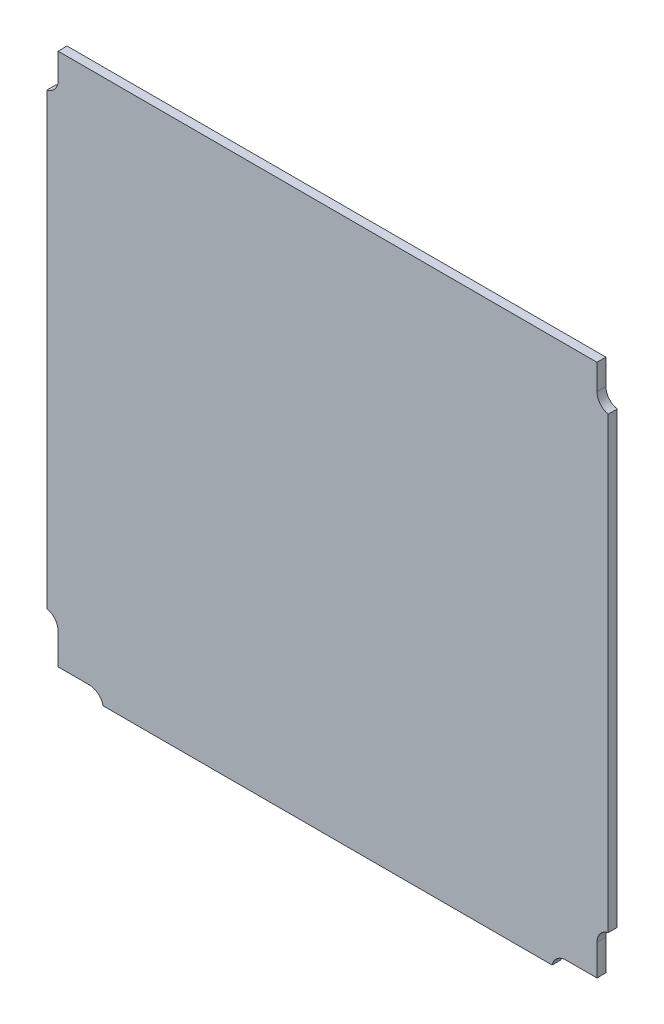
ISO-10303-21;
HEADER;
FILE_DESCRIPTION(('STEP AP214'),'2;1');
FILE_NAME('part.step','',(''),(''),'','','');
FILE_SCHEMA(('AUTOMOTIVE_DESIGN { 1 0 10303 214 1 1 1 1 }'));
ENDSEC;
DATA;
#1=APPLICATION_CONTEXT('core data for automotive mechanical design processes');
#2=APPLICATION_PROTOCOL_DEFINITION('international standard','automotive_design',2000,#1);
#3=PRODUCT_CONTEXT('',#1,'mechanical');
#4=PRODUCT('Part','Part','',(#3));
#5=PRODUCT_RELATED_PRODUCT_CATEGORY('part','',(#4));
#6=PRODUCT_DEFINITION_FORMATION('','',#4);
#7=PRODUCT_DEFINITION_CONTEXT('part definition',#1,'design');
#8=PRODUCT_DEFINITION('design','',#6,#7);
#9=PRODUCT_DEFINITION_SHAPE('','',#8);
#10=(LENGTH_UNIT() NAMED_UNIT(*) SI_UNIT(.MILLI.,.METRE.));
#11=(NAMED_UNIT(*) PLANE_ANGLE_UNIT() SI_UNIT($,.RADIAN.));
#12=(NAMED_UNIT(*) SI_UNIT($,.STERADIAN.) SOLID_ANGLE_UNIT());
#13=UNCERTAINTY_MEASURE_WITH_UNIT(LENGTH_MEASURE(1.E-05),#10,'distance_accuracy_value','');
#14=(GEOMETRIC_REPRESENTATION_CONTEXT(3) GLOBAL_UNCERTAINTY_ASSIGNED_CONTEXT((#13)) GLOBAL_UNIT_ASSIGNED_CONTEXT((#10,
#11,#12)) REPRESENTATION_CONTEXT('',''));
#15=CARTESIAN_POINT('',(0.,0.,0.));
#16=DIRECTION('',(0.,0.,1.));
#17=DIRECTION('',(1.,0.,0.));
#18=AXIS2_PLACEMENT_3D('',#15,#16,#17);
#19=CARTESIAN_POINT('',(48.,0.,1.5875));
#20=DIRECTION('',(-1.,0.,0.));
#21=DIRECTION('',(0.,0.,1.));
#22=AXIS2_PLACEMENT_3D('',#19,#20,#21);
#23=PLANE('',#22);
#24=DIRECTION('',(0.,1.,0.));
#25=VECTOR('',#24,1.);
#26=CARTESIAN_POINT('',(48.,0.,1.5875));
#27=LINE('',#26,#25);
#28=CARTESIAN_POINT('',(48.,42.4819347291982,1.5875));
#29=VERTEX_POINT('',#28);
#30=CARTESIAN_POINT('',(48.,47.,1.5875));
#31=VERTEX_POINT('',#30);
#32=EDGE_CURVE('E149',#29,#31,#27,.T.);
#33=ORIENTED_EDGE('',*,*,#32,.F.);
#34=DIRECTION('',(0.,0.,-1.));
#35=VECTOR('',#34,1.);
#36=CARTESIAN_POINT('',(48.,42.4819347291982,1.5875));
#37=LINE('',#36,#35);
#38=CARTESIAN_POINT('',(48.,42.4819347291982,0.));
#39=VERTEX_POINT('',#38);
#40=EDGE_CURVE('E188',#29,#39,#37,.T.);
#41=ORIENTED_EDGE('',*,*,#40,.T.);
#42=DIRECTION('',(0.,1.,0.));
#43=VECTOR('',#42,1.);
#44=CARTESIAN_POINT('',(48.,0.,0.));
#45=LINE('',#44,#43);
#46=CARTESIAN_POINT('',(48.,47.,0.));
#47=VERTEX_POINT('',#46);
#48=EDGE_CURVE('E171',#39,#47,#45,.T.);
#49=ORIENTED_EDGE('',*,*,#48,.T.);
#50=DIRECTION('',(0.,0.,-1.));
#51=VECTOR('',#50,1.);
#52=CARTESIAN_POINT('',(48.,47.,1.5875));
#53=LINE('',#52,#51);
#54=EDGE_CURVE('E165',#31,#47,#53,.T.);
#55=ORIENTED_EDGE('',*,*,#54,.F.);
#56=EDGE_LOOP('',(#33,#41,#49,#55));
#57=FACE_BOUND('',#56,.T.);
#58=ADVANCED_FACE('F37',(#57),#23,.F.);
#59=CARTESIAN_POINT('',(0.,47.,1.5875));
#60=DIRECTION('',(0.,-1.,0.));
#61=DIRECTION('',(1.,0.,0.));
#62=AXIS2_PLACEMENT_3D('',#59,#60,#61);
#63=PLANE('',#62);
#64=DIRECTION('',(-1.,0.,0.));
#65=VECTOR('',#64,1.);
#66=CARTESIAN_POINT('',(0.,47.,0.));
#67=LINE('',#66,#65);
#68=CARTESIAN_POINT('',(-48.,47.,0.));
#69=VERTEX_POINT('',#68);
#70=EDGE_CURVE('E263',#47,#69,#67,.T.);
#71=ORIENTED_EDGE('',*,*,#70,.T.);
#72=DIRECTION('',(0.,0.,-1.));
#73=VECTOR('',#72,1.);
#74=CARTESIAN_POINT('',(-48.,47.,1.5875));
#75=LINE('',#74,#73);
#76=CARTESIAN_POINT('',(-48.,47.,1.5875));
#77=VERTEX_POINT('',#76);
#78=EDGE_CURVE('E167',#77,#69,#75,.T.);
#79=ORIENTED_EDGE('',*,*,#78,.F.);
#80=DIRECTION('',(-1.,0.,0.));
#81=VECTOR('',#80,1.);
#82=CARTESIAN_POINT('',(0.,47.,1.5875));
#83=LINE('',#82,#81);
#84=EDGE_CURVE('E152',#31,#77,#83,.T.);
#85=ORIENTED_EDGE('',*,*,#84,.F.);
#86=ORIENTED_EDGE('',*,*,#54,.T.);
#87=EDGE_LOOP('',(#71,#79,#85,#86));
#88=FACE_BOUND('',#87,.T.);
#89=ADVANCED_FACE('F164',(#88),#63,.F.);
#90=CARTESIAN_POINT('',(-48.0000000000001,1.42742960308949E-13,1.5875));
#91=DIRECTION('',(1.,0.,0.));
#92=DIRECTION('',(0.,1.,0.));
#93=AXIS2_PLACEMENT_3D('',#90,#91,#92);
#94=PLANE('',#93);
#95=DIRECTION('',(0.,-1.,0.));
#96=VECTOR('',#95,1.);
#97=CARTESIAN_POINT('',(-48.0000000000001,1.42742960308949E-13,0.));
#98=LINE('',#97,#96);
#99=CARTESIAN_POINT('',(-48.,42.4819347291981,0.));
#100=VERTEX_POINT('',#99);
#101=EDGE_CURVE('E259',#69,#100,#98,.T.);
#102=ORIENTED_EDGE('',*,*,#101,.T.);
#103=DIRECTION('',(0.,0.,-1.));
#104=VECTOR('',#103,1.);
#105=CARTESIAN_POINT('',(-48.,42.4819347291981,1.5875));
#106=LINE('',#105,#104);
#107=CARTESIAN_POINT('',(-48.,42.4819347291981,1.5875));
#108=VERTEX_POINT('',#107);
#109=EDGE_CURVE('E52',#100,#108,#106,.F.);
#110=ORIENTED_EDGE('',*,*,#109,.T.);
#111=DIRECTION('',(0.,-1.,0.));
#112=VECTOR('',#111,1.);
#113=CARTESIAN_POINT('',(-48.0000000000001,1.42742960308949E-13,1.5875));
#114=LINE('',#113,#112);
#115=EDGE_CURVE('E168',#77,#108,#114,.T.);
#116=ORIENTED_EDGE('',*,*,#115,.F.);
#117=ORIENTED_EDGE('',*,*,#78,.T.);
#118=EDGE_LOOP('',(#102,#110,#116,#117));
#119=FACE_BOUND('',#118,.T.);
#120=ADVANCED_FACE('F292',(#119),#94,.F.);
#121=CARTESIAN_POINT('',(-50.,0.,1.5875));
#122=DIRECTION('',(-1.,0.,0.));
#123=DIRECTION('',(0.,-1.,0.));
#124=AXIS2_PLACEMENT_3D('',#121,#122,#123);
#125=PLANE('',#124);
#126=DIRECTION('',(0.,1.,0.));
#127=VECTOR('',#126,1.);
#128=CARTESIAN_POINT('',(-50.,0.,0.));
#129=LINE('',#128,#127);
#130=CARTESIAN_POINT('',(-50.,-40.,0.));
#131=VERTEX_POINT('',#130);
#132=CARTESIAN_POINT('',(-50.,40.,0.));
#133=VERTEX_POINT('',#132);
#134=EDGE_CURVE('E252',#131,#133,#129,.T.);
#135=ORIENTED_EDGE('',*,*,#134,.F.);
#136=DIRECTION('',(0.,0.,-1.));
#137=VECTOR('',#136,1.);
#138=CARTESIAN_POINT('',(-50.,-40.,1.5875));
#139=LINE('',#138,#137);
#140=CARTESIAN_POINT('',(-50.,-40.,1.5875));
#141=VERTEX_POINT('',#140);
#142=EDGE_CURVE('E244',#141,#131,#139,.T.);
#143=ORIENTED_EDGE('',*,*,#142,.F.);
#144=DIRECTION('',(0.,1.,0.));
#145=VECTOR('',#144,1.);
#146=CARTESIAN_POINT('',(-50.,0.,1.5875));
#147=LINE('',#146,#145);
#148=CARTESIAN_POINT('',(-50.,40.,1.5875));
#149=VERTEX_POINT('',#148);
#150=EDGE_CURVE('E254',#141,#149,#147,.T.);
#151=ORIENTED_EDGE('',*,*,#150,.T.);
#152=DIRECTION('',(0.,0.,-1.));
#153=VECTOR('',#152,1.);
#154=CARTESIAN_POINT('',(-50.,40.,1.5875));
#155=LINE('',#154,#153);
#156=EDGE_CURVE('E178',#149,#133,#155,.T.);
#157=ORIENTED_EDGE('',*,*,#156,.T.);
#158=EDGE_LOOP('',(#135,#143,#151,#157));
#159=FACE_BOUND('',#158,.T.);
#160=ADVANCED_FACE('F251',(#159),#125,.T.);
#161=CARTESIAN_POINT('',(-47.9999999999999,0.,1.5875));
#162=DIRECTION('',(1.,0.,0.));
#163=DIRECTION('',(0.,1.,0.));
#164=AXIS2_PLACEMENT_3D('',#161,#162,#163);
#165=PLANE('',#164);
#166=DIRECTION('',(0.,-1.,0.));
#167=VECTOR('',#166,1.);
#168=CARTESIAN_POINT('',(-47.9999999999999,0.,1.5875));
#169=LINE('',#168,#167);
#170=CARTESIAN_POINT('',(-48.,-42.4819347291982,1.5875));
#171=VERTEX_POINT('',#170);
#172=CARTESIAN_POINT('',(-48.,-48.,1.5875));
#173=VERTEX_POINT('',#172);
#174=EDGE_CURVE('E294',#171,#173,#169,.T.);
#175=ORIENTED_EDGE('',*,*,#174,.F.);
#176=DIRECTION('',(0.,0.,1.));
#177=VECTOR('',#176,1.);
#178=CARTESIAN_POINT('',(-48.,-42.4819347291982,1.5875));
#179=LINE('',#178,#177);
#180=CARTESIAN_POINT('',(-48.,-42.4819347291982,0.));
#181=VERTEX_POINT('',#180);
#182=EDGE_CURVE('E173',#171,#181,#179,.F.);
#183=ORIENTED_EDGE('',*,*,#182,.T.);
#184=DIRECTION('',(0.,-1.,0.));
#185=VECTOR('',#184,1.);
#186=CARTESIAN_POINT('',(-47.9999999999999,0.,0.));
#187=LINE('',#186,#185);
#188=CARTESIAN_POINT('',(-48.,-48.,0.));
#189=VERTEX_POINT('',#188);
#190=EDGE_CURVE('E258',#181,#189,#187,.T.);
#191=ORIENTED_EDGE('',*,*,#190,.T.);
#192=DIRECTION('',(0.,0.,-1.));
#193=VECTOR('',#192,1.);
#194=CARTESIAN_POINT('',(-48.,-48.,1.5875));
#195=LINE('',#194,#193);
#196=EDGE_CURVE('E241',#173,#189,#195,.T.);
#197=ORIENTED_EDGE('',*,*,#196,.F.);
#198=EDGE_LOOP('',(#175,#183,#191,#197));
#199=FACE_BOUND('',#198,.T.);
#200=ADVANCED_FACE('F342',(#199),#165,.F.);
#201=CARTESIAN_POINT('',(0.,-48.0000000000001,1.5875));
#202=DIRECTION('',(0.,1.,0.));
#203=DIRECTION('',(-1.,0.,0.));
#204=AXIS2_PLACEMENT_3D('',#201,#202,#203);
#205=PLANE('',#204);
#206=DIRECTION('',(1.,0.,0.));
#207=VECTOR('',#206,1.);
#208=CARTESIAN_POINT('',(0.,-48.0000000000001,0.));
#209=LINE('',#208,#207);
#210=CARTESIAN_POINT('',(-42.4819347291981,-48.,0.));
#211=VERTEX_POINT('',#210);
#212=EDGE_CURVE('E261',#189,#211,#209,.T.);
#213=ORIENTED_EDGE('',*,*,#212,.T.);
#214=DIRECTION('',(0.,0.,1.));
#215=VECTOR('',#214,1.);
#216=CARTESIAN_POINT('',(-42.4819347291981,-48.,1.5875));
#217=LINE('',#216,#215);
#218=CARTESIAN_POINT('',(-42.4819347291981,-48.,1.5875));
#219=VERTEX_POINT('',#218);
#220=EDGE_CURVE('E176',#211,#219,#217,.T.);
#221=ORIENTED_EDGE('',*,*,#220,.T.);
#222=DIRECTION('',(1.,0.,0.));
#223=VECTOR('',#222,1.);
#224=CARTESIAN_POINT('',(0.,-48.0000000000001,1.5875));
#225=LINE('',#224,#223);
#226=EDGE_CURVE('E298',#173,#219,#225,.T.);
#227=ORIENTED_EDGE('',*,*,#226,.F.);
#228=ORIENTED_EDGE('',*,*,#196,.T.);
#229=EDGE_LOOP('',(#213,#221,#227,#228));
#230=FACE_BOUND('',#229,.T.);
#231=ADVANCED_FACE('F317',(#230),#205,.F.);
#232=CARTESIAN_POINT('',(0.,-50.,1.5875));
#233=DIRECTION('',(0.,1.,0.));
#234=DIRECTION('',(0.,0.,1.));
#235=AXIS2_PLACEMENT_3D('',#232,#233,#234);
#236=PLANE('',#235);
#237=DIRECTION('',(1.,0.,0.));
#238=VECTOR('',#237,1.);
#239=CARTESIAN_POINT('',(0.,-50.,0.));
#240=LINE('',#239,#238);
#241=CARTESIAN_POINT('',(-40.,-50.,0.));
#242=VERTEX_POINT('',#241);
#243=CARTESIAN_POINT('',(40.,-50.,0.));
#244=VERTEX_POINT('',#243);
#245=EDGE_CURVE('E269',#242,#244,#240,.T.);
#246=ORIENTED_EDGE('',*,*,#245,.T.);
#247=DIRECTION('',(0.,0.,-1.));
#248=VECTOR('',#247,1.);
#249=CARTESIAN_POINT('',(40.,-50.,1.5875));
#250=LINE('',#249,#248);
#251=CARTESIAN_POINT('',(40.,-50.,1.5875));
#252=VERTEX_POINT('',#251);
#253=EDGE_CURVE('E235',#252,#244,#250,.T.);
#254=ORIENTED_EDGE('',*,*,#253,.F.);
#255=DIRECTION('',(1.,0.,0.));
#256=VECTOR('',#255,1.);
#257=CARTESIAN_POINT('',(0.,-50.,1.5875));
#258=LINE('',#257,#256);
#259=CARTESIAN_POINT('',(-40.,-50.,1.5875));
#260=VERTEX_POINT('',#259);
#261=EDGE_CURVE('E288',#260,#252,#258,.T.);
#262=ORIENTED_EDGE('',*,*,#261,.F.);
#263=DIRECTION('',(0.,0.,-1.));
#264=VECTOR('',#263,1.);
#265=CARTESIAN_POINT('',(-40.,-50.,1.5875));
#266=LINE('',#265,#264);
#267=EDGE_CURVE('E238',#260,#242,#266,.T.);
#268=ORIENTED_EDGE('',*,*,#267,.T.);
#269=EDGE_LOOP('',(#246,#254,#262,#268));
#270=FACE_BOUND('',#269,.T.);
#271=ADVANCED_FACE('F306',(#270),#236,.F.);
#272=CARTESIAN_POINT('',(-1.2490009027033E-13,-47.9999999999999,1.5875));
#273=DIRECTION('',(0.,1.,0.));
#274=DIRECTION('',(-1.,0.,0.));
#275=AXIS2_PLACEMENT_3D('',#272,#273,#274);
#276=PLANE('',#275);
#277=DIRECTION('',(1.,0.,0.));
#278=VECTOR('',#277,1.);
#279=CARTESIAN_POINT('',(-1.2490009027033E-13,-47.9999999999999,1.5875));
#280=LINE('',#279,#278);
#281=CARTESIAN_POINT('',(42.4819347291982,-48.,1.5875));
#282=VERTEX_POINT('',#281);
#283=CARTESIAN_POINT('',(48.,-48.,1.5875));
#284=VERTEX_POINT('',#283);
#285=EDGE_CURVE('E286',#282,#284,#280,.T.);
#286=ORIENTED_EDGE('',*,*,#285,.F.);
#287=DIRECTION('',(0.,0.,-1.));
#288=VECTOR('',#287,1.);
#289=CARTESIAN_POINT('',(42.4819347291982,-48.,1.5875));
#290=LINE('',#289,#288);
#291=CARTESIAN_POINT('',(42.4819347291982,-48.,0.));
#292=VERTEX_POINT('',#291);
#293=EDGE_CURVE('E183',#282,#292,#290,.T.);
#294=ORIENTED_EDGE('',*,*,#293,.T.);
#295=DIRECTION('',(1.,0.,0.));
#296=VECTOR('',#295,1.);
#297=CARTESIAN_POINT('',(-1.2490009027033E-13,-47.9999999999999,0.));
#298=LINE('',#297,#296);
#299=CARTESIAN_POINT('',(48.,-48.,0.));
#300=VERTEX_POINT('',#299);
#301=EDGE_CURVE('E272',#292,#300,#298,.T.);
#302=ORIENTED_EDGE('',*,*,#301,.T.);
#303=DIRECTION('',(0.,0.,-1.));
#304=VECTOR('',#303,1.);
#305=CARTESIAN_POINT('',(48.,-48.,1.5875));
#306=LINE('',#305,#304);
#307=EDGE_CURVE('E227',#284,#300,#306,.T.);
#308=ORIENTED_EDGE('',*,*,#307,.F.);
#309=EDGE_LOOP('',(#286,#294,#302,#308));
#310=FACE_BOUND('',#309,.T.);
#311=ADVANCED_FACE('F312',(#310),#276,.F.);
#312=CARTESIAN_POINT('',(48.0000000000001,0.,1.5875));
#313=DIRECTION('',(-1.,0.,0.));
#314=DIRECTION('',(0.,-1.,0.));
#315=AXIS2_PLACEMENT_3D('',#312,#313,#314);
#316=PLANE('',#315);
#317=DIRECTION('',(0.,1.,0.));
#318=VECTOR('',#317,1.);
#319=CARTESIAN_POINT('',(48.0000000000001,0.,0.));
#320=LINE('',#319,#318);
#321=CARTESIAN_POINT('',(48.,-42.4819347291982,0.));
#322=VERTEX_POINT('',#321);
#323=EDGE_CURVE('E222',#300,#322,#320,.T.);
#324=ORIENTED_EDGE('',*,*,#323,.T.);
#325=DIRECTION('',(0.,0.,1.));
#326=VECTOR('',#325,1.);
#327=CARTESIAN_POINT('',(48.,-42.4819347291982,1.5875));
#328=LINE('',#327,#326);
#329=CARTESIAN_POINT('',(48.,-42.4819347291982,1.5875));
#330=VERTEX_POINT('',#329);
#331=EDGE_CURVE('E186',#322,#330,#328,.T.);
#332=ORIENTED_EDGE('',*,*,#331,.T.);
#333=DIRECTION('',(0.,1.,0.));
#334=VECTOR('',#333,1.);
#335=CARTESIAN_POINT('',(48.0000000000001,0.,1.5875));
#336=LINE('',#335,#334);
#337=EDGE_CURVE('E229',#284,#330,#336,.T.);
#338=ORIENTED_EDGE('',*,*,#337,.F.);
#339=ORIENTED_EDGE('',*,*,#307,.T.);
#340=EDGE_LOOP('',(#324,#332,#338,#339));
#341=FACE_BOUND('',#340,.T.);
#342=ADVANCED_FACE('F277',(#341),#316,.F.);
#343=CARTESIAN_POINT('',(50.,0.,1.5875));
#344=DIRECTION('',(-1.,0.,0.));
#345=DIRECTION('',(0.,-1.,0.));
#346=AXIS2_PLACEMENT_3D('',#343,#344,#345);
#347=PLANE('',#346);
#348=DIRECTION('',(0.,1.,0.));
#349=VECTOR('',#348,1.);
#350=CARTESIAN_POINT('',(50.,0.,0.));
#351=LINE('',#350,#349);
#352=CARTESIAN_POINT('',(50.,-40.,0.));
#353=VERTEX_POINT('',#352);
#354=CARTESIAN_POINT('',(50.,40.,0.));
#355=VERTEX_POINT('',#354);
#356=EDGE_CURVE('E160',#353,#355,#351,.T.);
#357=ORIENTED_EDGE('',*,*,#356,.T.);
#358=DIRECTION('',(0.,0.,-1.));
#359=VECTOR('',#358,1.);
#360=CARTESIAN_POINT('',(50.,40.,1.5875));
#361=LINE('',#360,#359);
#362=CARTESIAN_POINT('',(50.,40.,1.5875));
#363=VERTEX_POINT('',#362);
#364=EDGE_CURVE('E219',#363,#355,#361,.T.);
#365=ORIENTED_EDGE('',*,*,#364,.F.);
#366=DIRECTION('',(0.,1.,0.));
#367=VECTOR('',#366,1.);
#368=CARTESIAN_POINT('',(50.,0.,1.5875));
#369=LINE('',#368,#367);
#370=CARTESIAN_POINT('',(50.,-40.,1.5875));
#371=VERTEX_POINT('',#370);
#372=EDGE_CURVE('E225',#371,#363,#369,.T.);
#373=ORIENTED_EDGE('',*,*,#372,.F.);
#374=DIRECTION('',(0.,0.,-1.));
#375=VECTOR('',#374,1.);
#376=CARTESIAN_POINT('',(50.,-40.,1.5875));
#377=LINE('',#376,#375);
#378=EDGE_CURVE('E221',#371,#353,#377,.T.);
#379=ORIENTED_EDGE('',*,*,#378,.T.);
#380=EDGE_LOOP('',(#357,#365,#373,#379));
#381=FACE_BOUND('',#380,.T.);
#382=ADVANCED_FACE('F217',(#381),#347,.F.);
#383=CARTESIAN_POINT('',(0.,0.,1.5875));
#384=DIRECTION('',(0.,0.,1.));
#385=DIRECTION('',(1.,0.,0.));
#386=AXIS2_PLACEMENT_3D('',#383,#384,#385);
#387=PLANE('',#386);
#388=ORIENTED_EDGE('',*,*,#372,.T.);
#389=CARTESIAN_POINT('',(50.54,42.4819347291982,1.5875));
#390=DIRECTION('',(0.,0.,1.));
#391=DIRECTION('',(1.,0.,0.));
#392=AXIS2_PLACEMENT_3D('',#389,#390,#391);
#393=CIRCLE('',#392,2.54);
#394=EDGE_CURVE('E155',#363,#29,#393,.F.);
#395=ORIENTED_EDGE('',*,*,#394,.T.);
#396=ORIENTED_EDGE('',*,*,#32,.T.);
#397=ORIENTED_EDGE('',*,*,#84,.T.);
#398=ORIENTED_EDGE('',*,*,#115,.T.);
#399=CARTESIAN_POINT('',(-50.54,42.4819347291981,1.5875));
#400=DIRECTION('',(0.,0.,1.));
#401=DIRECTION('',(1.,0.,0.));
#402=AXIS2_PLACEMENT_3D('',#399,#400,#401);
#403=CIRCLE('',#402,2.54);
#404=EDGE_CURVE('E11',#108,#149,#403,.F.);
#405=ORIENTED_EDGE('',*,*,#404,.T.);
#406=ORIENTED_EDGE('',*,*,#150,.F.);
#407=CARTESIAN_POINT('',(-50.54,-42.4819347291982,1.5875));
#408=DIRECTION('',(0.,0.,1.));
#409=DIRECTION('',(1.,0.,0.));
#410=AXIS2_PLACEMENT_3D('',#407,#408,#409);
#411=CIRCLE('',#410,2.54);
#412=EDGE_CURVE('E193',#141,#171,#411,.F.);
#413=ORIENTED_EDGE('',*,*,#412,.T.);
#414=ORIENTED_EDGE('',*,*,#174,.T.);
#415=ORIENTED_EDGE('',*,*,#226,.T.);
#416=CARTESIAN_POINT('',(-42.4819347291981,-50.54,1.5875));
#417=DIRECTION('',(0.,0.,1.));
#418=DIRECTION('',(1.,0.,0.));
#419=AXIS2_PLACEMENT_3D('',#416,#417,#418);
#420=CIRCLE('',#419,2.54);
#421=EDGE_CURVE('E197',#219,#260,#420,.F.);
#422=ORIENTED_EDGE('',*,*,#421,.T.);
#423=ORIENTED_EDGE('',*,*,#261,.T.);
#424=CARTESIAN_POINT('',(42.4819347291982,-50.54,1.5875));
#425=DIRECTION('',(0.,0.,1.));
#426=DIRECTION('',(1.,0.,0.));
#427=AXIS2_PLACEMENT_3D('',#424,#425,#426);
#428=CIRCLE('',#427,2.54);
#429=EDGE_CURVE('E201',#252,#282,#428,.F.);
#430=ORIENTED_EDGE('',*,*,#429,.T.);
#431=ORIENTED_EDGE('',*,*,#285,.T.);
#432=ORIENTED_EDGE('',*,*,#337,.T.);
#433=CARTESIAN_POINT('',(50.54,-42.4819347291982,1.5875));
#434=DIRECTION('',(0.,0.,1.));
#435=DIRECTION('',(1.,0.,0.));
#436=AXIS2_PLACEMENT_3D('',#433,#434,#435);
#437=CIRCLE('',#436,2.54);
#438=EDGE_CURVE('E205',#330,#371,#437,.F.);
#439=ORIENTED_EDGE('',*,*,#438,.T.);
#440=EDGE_LOOP('',(#388,#395,#396,#397,#398,#405,#406,#413,#414,#415,#422,#423,#430,#431,#432,#439));
#441=FACE_BOUND('',#440,.T.);
#442=ADVANCED_FACE('F151',(#441),#387,.T.);
#443=CARTESIAN_POINT('',(0.,0.,0.));
#444=DIRECTION('',(0.,0.,1.));
#445=DIRECTION('',(1.,0.,0.));
#446=AXIS2_PLACEMENT_3D('',#443,#444,#445);
#447=PLANE('',#446);
#448=ORIENTED_EDGE('',*,*,#48,.F.);
#449=CARTESIAN_POINT('',(50.54,42.4819347291982,0.));
#450=DIRECTION('',(0.,0.,1.));
#451=DIRECTION('',(1.,0.,0.));
#452=AXIS2_PLACEMENT_3D('',#449,#450,#451);
#453=CIRCLE('',#452,2.54);
#454=EDGE_CURVE('E207',#39,#355,#453,.T.);
#455=ORIENTED_EDGE('',*,*,#454,.T.);
#456=ORIENTED_EDGE('',*,*,#356,.F.);
#457=CARTESIAN_POINT('',(50.54,-42.4819347291982,0.));
#458=DIRECTION('',(0.,0.,1.));
#459=DIRECTION('',(1.,0.,0.));
#460=AXIS2_PLACEMENT_3D('',#457,#458,#459);
#461=CIRCLE('',#460,2.54);
#462=EDGE_CURVE('E203',#353,#322,#461,.T.);
#463=ORIENTED_EDGE('',*,*,#462,.T.);
#464=ORIENTED_EDGE('',*,*,#323,.F.);
#465=ORIENTED_EDGE('',*,*,#301,.F.);
#466=CARTESIAN_POINT('',(42.4819347291982,-50.54,0.));
#467=DIRECTION('',(0.,0.,1.));
#468=DIRECTION('',(1.,0.,0.));
#469=AXIS2_PLACEMENT_3D('',#466,#467,#468);
#470=CIRCLE('',#469,2.54);
#471=EDGE_CURVE('E199',#292,#244,#470,.T.);
#472=ORIENTED_EDGE('',*,*,#471,.T.);
#473=ORIENTED_EDGE('',*,*,#245,.F.);
#474=CARTESIAN_POINT('',(-42.4819347291981,-50.54,0.));
#475=DIRECTION('',(0.,0.,1.));
#476=DIRECTION('',(1.,0.,0.));
#477=AXIS2_PLACEMENT_3D('',#474,#475,#476);
#478=CIRCLE('',#477,2.54);
#479=EDGE_CURVE('E195',#242,#211,#478,.T.);
#480=ORIENTED_EDGE('',*,*,#479,.T.);
#481=ORIENTED_EDGE('',*,*,#212,.F.);
#482=ORIENTED_EDGE('',*,*,#190,.F.);
#483=CARTESIAN_POINT('',(-50.54,-42.4819347291982,0.));
#484=DIRECTION('',(0.,0.,1.));
#485=DIRECTION('',(1.,0.,0.));
#486=AXIS2_PLACEMENT_3D('',#483,#484,#485);
#487=CIRCLE('',#486,2.54);
#488=EDGE_CURVE('E191',#181,#131,#487,.T.);
#489=ORIENTED_EDGE('',*,*,#488,.T.);
#490=ORIENTED_EDGE('',*,*,#134,.T.);
#491=CARTESIAN_POINT('',(-50.54,42.4819347291981,0.));
#492=DIRECTION('',(0.,0.,1.));
#493=DIRECTION('',(1.,0.,0.));
#494=AXIS2_PLACEMENT_3D('',#491,#492,#493);
#495=CIRCLE('',#494,2.54);
#496=EDGE_CURVE('E45',#133,#100,#495,.T.);
#497=ORIENTED_EDGE('',*,*,#496,.T.);
#498=ORIENTED_EDGE('',*,*,#101,.F.);
#499=ORIENTED_EDGE('',*,*,#70,.F.);
#500=EDGE_LOOP('',(#448,#455,#456,#463,#464,#465,#472,#473,#480,#481,#482,#489,#490,#497,#498,#499));
#501=FACE_BOUND('',#500,.T.);
#502=ADVANCED_FACE('F211',(#501),#447,.F.);
#503=CARTESIAN_POINT('',(-50.54,-42.4819347291982,1.5875));
#504=DIRECTION('',(0.,0.,1.));
#505=DIRECTION('',(1.,0.,0.));
#506=AXIS2_PLACEMENT_3D('',#503,#504,#505);
#507=CYLINDRICAL_SURFACE('',#506,2.54);
#508=ORIENTED_EDGE('',*,*,#412,.F.);
#509=ORIENTED_EDGE('',*,*,#142,.T.);
#510=ORIENTED_EDGE('',*,*,#488,.F.);
#511=ORIENTED_EDGE('',*,*,#182,.F.);
#512=EDGE_LOOP('',(#508,#509,#510,#511));
#513=FACE_BOUND('',#512,.T.);
#514=ADVANCED_FACE('F322',(#513),#507,.F.);
#515=CARTESIAN_POINT('',(-42.4819347291981,-50.54,1.5875));
#516=DIRECTION('',(0.,0.,1.));
#517=DIRECTION('',(1.,0.,0.));
#518=AXIS2_PLACEMENT_3D('',#515,#516,#517);
#519=CYLINDRICAL_SURFACE('',#518,2.54);
#520=ORIENTED_EDGE('',*,*,#421,.F.);
#521=ORIENTED_EDGE('',*,*,#220,.F.);
#522=ORIENTED_EDGE('',*,*,#479,.F.);
#523=ORIENTED_EDGE('',*,*,#267,.F.);
#524=EDGE_LOOP('',(#520,#521,#522,#523));
#525=FACE_BOUND('',#524,.T.);
#526=ADVANCED_FACE('F320',(#525),#519,.F.);
#527=CARTESIAN_POINT('',(42.4819347291982,-50.54,1.5875));
#528=DIRECTION('',(0.,0.,-1.));
#529=DIRECTION('',(-1.,0.,0.));
#530=AXIS2_PLACEMENT_3D('',#527,#528,#529);
#531=CYLINDRICAL_SURFACE('',#530,2.54);
#532=ORIENTED_EDGE('',*,*,#429,.F.);
#533=ORIENTED_EDGE('',*,*,#253,.T.);
#534=ORIENTED_EDGE('',*,*,#471,.F.);
#535=ORIENTED_EDGE('',*,*,#293,.F.);
#536=EDGE_LOOP('',(#532,#533,#534,#535));
#537=FACE_BOUND('',#536,.T.);
#538=ADVANCED_FACE('F310',(#537),#531,.F.);
#539=CARTESIAN_POINT('',(50.54,-42.4819347291982,1.5875));
#540=DIRECTION('',(0.,0.,1.));
#541=DIRECTION('',(1.,0.,0.));
#542=AXIS2_PLACEMENT_3D('',#539,#540,#541);
#543=CYLINDRICAL_SURFACE('',#542,2.54);
#544=ORIENTED_EDGE('',*,*,#438,.F.);
#545=ORIENTED_EDGE('',*,*,#331,.F.);
#546=ORIENTED_EDGE('',*,*,#462,.F.);
#547=ORIENTED_EDGE('',*,*,#378,.F.);
#548=EDGE_LOOP('',(#544,#545,#546,#547));
#549=FACE_BOUND('',#548,.T.);
#550=ADVANCED_FACE('F284',(#549),#543,.F.);
#551=CARTESIAN_POINT('',(50.54,42.4819347291982,1.5875));
#552=DIRECTION('',(0.,0.,-1.));
#553=DIRECTION('',(-1.,0.,0.));
#554=AXIS2_PLACEMENT_3D('',#551,#552,#553);
#555=CYLINDRICAL_SURFACE('',#554,2.54);
#556=ORIENTED_EDGE('',*,*,#394,.F.);
#557=ORIENTED_EDGE('',*,*,#364,.T.);
#558=ORIENTED_EDGE('',*,*,#454,.F.);
#559=ORIENTED_EDGE('',*,*,#40,.F.);
#560=EDGE_LOOP('',(#556,#557,#558,#559));
#561=FACE_BOUND('',#560,.T.);
#562=ADVANCED_FACE('F224',(#561),#555,.F.);
#563=CARTESIAN_POINT('',(-50.54,42.4819347291981,1.5875));
#564=DIRECTION('',(0.,0.,-1.));
#565=DIRECTION('',(-1.,0.,0.));
#566=AXIS2_PLACEMENT_3D('',#563,#564,#565);
#567=CYLINDRICAL_SURFACE('',#566,2.54);
#568=ORIENTED_EDGE('',*,*,#404,.F.);
#569=ORIENTED_EDGE('',*,*,#109,.F.);
#570=ORIENTED_EDGE('',*,*,#496,.F.);
#571=ORIENTED_EDGE('',*,*,#156,.F.);
#572=EDGE_LOOP('',(#568,#569,#570,#571));
#573=FACE_BOUND('',#572,.T.);
#574=ADVANCED_FACE('F39',(#573),#567,.F.);
#575=CLOSED_SHELL('',(#58,#89,#120,#160,#200,#231,#271,#311,#342,#382,#442,#502,#514,#526,#538,
#550,#562,#574));
#576=MANIFOLD_SOLID_BREP('B2',#575);
#577=ADVANCED_BREP_SHAPE_REPRESENTATION('',(#18,#576),#14);
#578=SHAPE_DEFINITION_REPRESENTATION(#9,#577);
ENDSEC;
END-ISO-10303-21;
